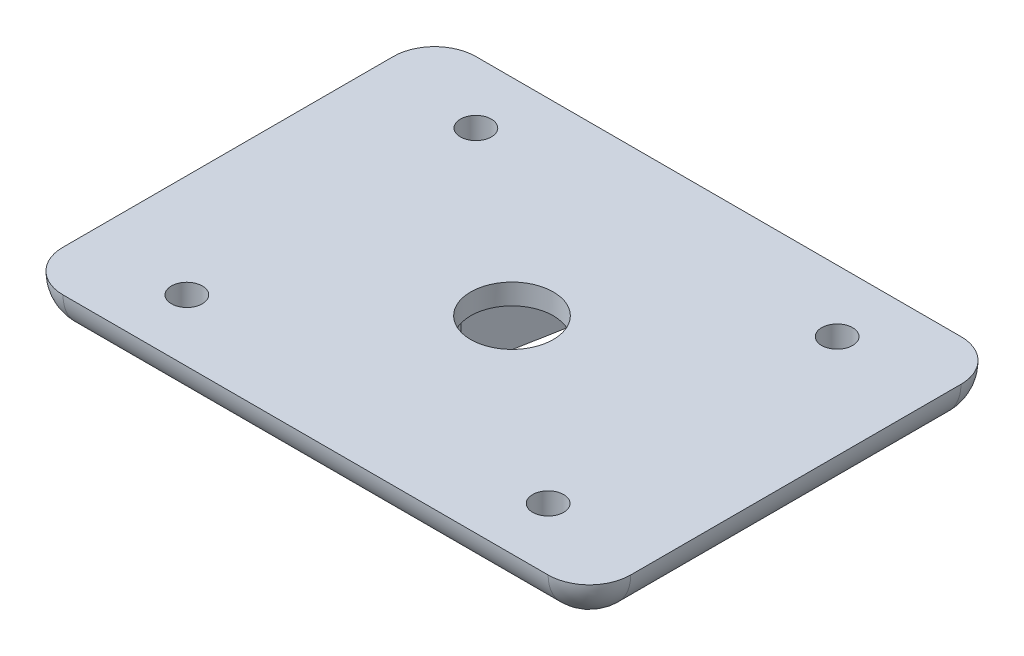
ISO-10303-21;
HEADER;
FILE_DESCRIPTION(('STEP AP214'),'2;1');
FILE_NAME('part.step','',(''),(''),'','','');
FILE_SCHEMA(('AUTOMOTIVE_DESIGN { 1 0 10303 214 1 1 1 1 }'));
ENDSEC;
DATA;
#1=APPLICATION_CONTEXT('core data for automotive mechanical design processes');
#2=APPLICATION_PROTOCOL_DEFINITION('international standard','automotive_design',2000,#1);
#3=PRODUCT_CONTEXT('',#1,'mechanical');
#4=PRODUCT('Part','Part','',(#3));
#5=PRODUCT_RELATED_PRODUCT_CATEGORY('part','',(#4));
#6=PRODUCT_DEFINITION_FORMATION('','',#4);
#7=PRODUCT_DEFINITION_CONTEXT('part definition',#1,'design');
#8=PRODUCT_DEFINITION('design','',#6,#7);
#9=PRODUCT_DEFINITION_SHAPE('','',#8);
#10=(LENGTH_UNIT() NAMED_UNIT(*) SI_UNIT(.MILLI.,.METRE.));
#11=(NAMED_UNIT(*) PLANE_ANGLE_UNIT() SI_UNIT($,.RADIAN.));
#12=(NAMED_UNIT(*) SI_UNIT($,.STERADIAN.) SOLID_ANGLE_UNIT());
#13=UNCERTAINTY_MEASURE_WITH_UNIT(LENGTH_MEASURE(1.E-05),#10,'distance_accuracy_value','');
#14=(GEOMETRIC_REPRESENTATION_CONTEXT(3) GLOBAL_UNCERTAINTY_ASSIGNED_CONTEXT((#13)) GLOBAL_UNIT_ASSIGNED_CONTEXT((#10,
#11,#12)) REPRESENTATION_CONTEXT('',''));
#15=CARTESIAN_POINT('',(0.,0.,0.));
#16=DIRECTION('',(0.,0.,1.));
#17=DIRECTION('',(1.,0.,0.));
#18=AXIS2_PLACEMENT_3D('',#15,#16,#17);
#19=CARTESIAN_POINT('',(0.,-1.,0.));
#20=DIRECTION('',(0.,1.,0.));
#21=DIRECTION('',(0.,0.,1.));
#22=AXIS2_PLACEMENT_3D('',#19,#20,#21);
#23=CYLINDRICAL_SURFACE('',#22,4.);
#24=CARTESIAN_POINT('',(0.,4.,0.));
#25=DIRECTION('',(0.,1.,0.));
#26=DIRECTION('',(0.,0.,1.));
#27=AXIS2_PLACEMENT_3D('',#24,#25,#26);
#28=CIRCLE('',#27,4.);
#29=CARTESIAN_POINT('',(0.,4.,4.));
#30=VERTEX_POINT('',#29);
#31=EDGE_CURVE('E217',#30,#30,#28,.T.);
#32=ORIENTED_EDGE('',*,*,#31,.T.);
#33=EDGE_LOOP('',(#32));
#34=FACE_BOUND('',#33,.T.);
#35=CARTESIAN_POINT('',(0.,2.,0.));
#36=DIRECTION('',(0.,-1.,0.));
#37=DIRECTION('',(0.,0.,-1.));
#38=AXIS2_PLACEMENT_3D('',#35,#36,#37);
#39=CIRCLE('',#38,4.);
#40=CARTESIAN_POINT('',(0.,2.,-4.));
#41=VERTEX_POINT('',#40);
#42=EDGE_CURVE('E45',#41,#41,#39,.F.);
#43=ORIENTED_EDGE('',*,*,#42,.F.);
#44=EDGE_LOOP('',(#43));
#45=FACE_BOUND('',#44,.T.);
#46=ADVANCED_FACE('F41',(#34,#45),#23,.F.);
#47=CARTESIAN_POINT('',(0.,-3.,0.));
#48=DIRECTION('',(0.,1.,0.));
#49=DIRECTION('',(0.,0.,1.));
#50=AXIS2_PLACEMENT_3D('',#47,#48,#49);
#51=CYLINDRICAL_SURFACE('',#50,9.70557638721724);
#52=CARTESIAN_POINT('',(0.,0.,0.));
#53=DIRECTION('',(0.,1.,0.));
#54=DIRECTION('',(0.,0.,1.));
#55=AXIS2_PLACEMENT_3D('',#52,#53,#54);
#56=CIRCLE('',#55,9.70557638721724);
#57=CARTESIAN_POINT('',(3.22672216566245,0.,-9.15349534733762));
#58=VERTEX_POINT('',#57);
#59=CARTESIAN_POINT('',(3.22672216566245,0.,9.15349534733762));
#60=VERTEX_POINT('',#59);
#61=EDGE_CURVE('E50',#58,#60,#56,.F.);
#62=ORIENTED_EDGE('',*,*,#61,.T.);
#63=DIRECTION('',(0.,-1.,0.));
#64=VECTOR('',#63,1.);
#65=CARTESIAN_POINT('',(3.22672216566245,2.,9.15349534733762));
#66=LINE('',#65,#64);
#67=CARTESIAN_POINT('',(3.22672216566245,-3.,9.15349534733762));
#68=VERTEX_POINT('',#67);
#69=EDGE_CURVE('E194',#60,#68,#66,.T.);
#70=ORIENTED_EDGE('',*,*,#69,.T.);
#71=CARTESIAN_POINT('',(0.,-3.,0.));
#72=DIRECTION('',(0.,-1.,0.));
#73=DIRECTION('',(0.,0.,-1.));
#74=AXIS2_PLACEMENT_3D('',#71,#72,#73);
#75=CIRCLE('',#74,9.70557638721724);
#76=CARTESIAN_POINT('',(3.22672216566245,-3.,-9.15349534733762));
#77=VERTEX_POINT('',#76);
#78=EDGE_CURVE('E209',#77,#68,#75,.T.);
#79=ORIENTED_EDGE('',*,*,#78,.F.);
#80=DIRECTION('',(0.,-1.,0.));
#81=VECTOR('',#80,1.);
#82=CARTESIAN_POINT('',(3.22672216566245,2.,-9.15349534733762));
#83=LINE('',#82,#81);
#84=EDGE_CURVE('E200',#58,#77,#83,.T.);
#85=ORIENTED_EDGE('',*,*,#84,.F.);
#86=EDGE_LOOP('',(#62,#70,#79,#85));
#87=FACE_BOUND('',#86,.T.);
#88=ADVANCED_FACE('F330',(#87),#51,.T.);
#89=CARTESIAN_POINT('',(0.,-3.,0.));
#90=DIRECTION('',(0.,-1.,0.));
#91=DIRECTION('',(0.,0.,-1.));
#92=AXIS2_PLACEMENT_3D('',#89,#90,#91);
#93=PLANE('',#92);
#94=DIRECTION('',(-0.18163727593894,0.,0.98336559833537));
#95=VECTOR('',#94,1.);
#96=CARTESIAN_POINT('',(3.22672216566245,-3.,9.15349534733762));
#97=LINE('',#96,#95);
#98=CARTESIAN_POINT('',(4.91746258105285,-3.,0.));
#99=VERTEX_POINT('',#98);
#100=EDGE_CURVE('E169',#99,#68,#97,.T.);
#101=ORIENTED_EDGE('',*,*,#100,.F.);
#102=DIRECTION('',(0.18163727593894,0.,0.98336559833537));
#103=VECTOR('',#102,1.);
#104=CARTESIAN_POINT('',(4.91746258105285,-3.,0.));
#105=LINE('',#104,#103);
#106=EDGE_CURVE('E171',#77,#99,#105,.T.);
#107=ORIENTED_EDGE('',*,*,#106,.F.);
#108=ORIENTED_EDGE('',*,*,#78,.T.);
#109=EDGE_LOOP('',(#101,#107,#108));
#110=FACE_BOUND('',#109,.T.);
#111=ADVANCED_FACE('F336',(#110),#93,.T.);
#112=CARTESIAN_POINT('',(0.,4.,0.));
#113=DIRECTION('',(0.,1.,0.));
#114=DIRECTION('',(0.,0.,1.));
#115=AXIS2_PLACEMENT_3D('',#112,#113,#114);
#116=PLANE('',#115);
#117=CARTESIAN_POINT('',(-17.5,4.,-14.));
#118=DIRECTION('',(0.,1.,0.));
#119=DIRECTION('',(0.,0.,1.));
#120=AXIS2_PLACEMENT_3D('',#117,#118,#119);
#121=CIRCLE('',#120,1.5);
#122=CARTESIAN_POINT('',(-17.5,4.,-12.5));
#123=VERTEX_POINT('',#122);
#124=EDGE_CURVE('E214',#123,#123,#121,.T.);
#125=ORIENTED_EDGE('',*,*,#124,.F.);
#126=EDGE_LOOP('',(#125));
#127=FACE_BOUND('',#126,.T.);
#128=CARTESIAN_POINT('',(17.5,4.,-14.));
#129=DIRECTION('',(0.,1.,0.));
#130=DIRECTION('',(0.,0.,1.));
#131=AXIS2_PLACEMENT_3D('',#128,#129,#130);
#132=CIRCLE('',#131,1.5);
#133=CARTESIAN_POINT('',(17.5,4.,-12.5));
#134=VERTEX_POINT('',#133);
#135=EDGE_CURVE('E218',#134,#134,#132,.T.);
#136=ORIENTED_EDGE('',*,*,#135,.F.);
#137=EDGE_LOOP('',(#136));
#138=FACE_BOUND('',#137,.T.);
#139=CARTESIAN_POINT('',(-17.5,4.,14.));
#140=DIRECTION('',(0.,1.,0.));
#141=DIRECTION('',(0.,0.,1.));
#142=AXIS2_PLACEMENT_3D('',#139,#140,#141);
#143=CIRCLE('',#142,1.5);
#144=CARTESIAN_POINT('',(-17.5,4.,15.5));
#145=VERTEX_POINT('',#144);
#146=EDGE_CURVE('E221',#145,#145,#143,.T.);
#147=ORIENTED_EDGE('',*,*,#146,.F.);
#148=EDGE_LOOP('',(#147));
#149=FACE_BOUND('',#148,.T.);
#150=CARTESIAN_POINT('',(17.5,4.,14.));
#151=DIRECTION('',(0.,1.,0.));
#152=DIRECTION('',(0.,0.,1.));
#153=AXIS2_PLACEMENT_3D('',#150,#151,#152);
#154=CIRCLE('',#153,1.5);
#155=CARTESIAN_POINT('',(17.5,4.,15.5));
#156=VERTEX_POINT('',#155);
#157=EDGE_CURVE('E224',#156,#156,#154,.T.);
#158=ORIENTED_EDGE('',*,*,#157,.F.);
#159=EDGE_LOOP('',(#158));
#160=FACE_BOUND('',#159,.T.);
#161=ORIENTED_EDGE('',*,*,#31,.F.);
#162=EDGE_LOOP('',(#161));
#163=FACE_BOUND('',#162,.T.);
#164=DIRECTION('',(1.,0.,0.));
#165=VECTOR('',#164,1.);
#166=CARTESIAN_POINT('',(-27.5,4.,-20.));
#167=LINE('',#166,#165);
#168=CARTESIAN_POINT('',(-23.5,4.,-20.));
#169=VERTEX_POINT('',#168);
#170=CARTESIAN_POINT('',(23.5,4.,-20.));
#171=VERTEX_POINT('',#170);
#172=EDGE_CURVE('E238',#169,#171,#167,.T.);
#173=ORIENTED_EDGE('',*,*,#172,.F.);
#174=CARTESIAN_POINT('',(-23.5,4.,-16.));
#175=DIRECTION('',(0.,1.,0.));
#176=DIRECTION('',(0.,0.,1.));
#177=AXIS2_PLACEMENT_3D('',#174,#175,#176);
#178=CIRCLE('',#177,4.);
#179=CARTESIAN_POINT('',(-27.5,4.,-16.));
#180=VERTEX_POINT('',#179);
#181=EDGE_CURVE('E276',#169,#180,#178,.T.);
#182=ORIENTED_EDGE('',*,*,#181,.T.);
#183=DIRECTION('',(0.,0.,1.));
#184=VECTOR('',#183,1.);
#185=CARTESIAN_POINT('',(-27.5,4.,-20.));
#186=LINE('',#185,#184);
#187=CARTESIAN_POINT('',(-27.5,4.,16.));
#188=VERTEX_POINT('',#187);
#189=EDGE_CURVE('E231',#180,#188,#186,.T.);
#190=ORIENTED_EDGE('',*,*,#189,.T.);
#191=CARTESIAN_POINT('',(-23.5,4.,16.));
#192=DIRECTION('',(0.,1.,0.));
#193=DIRECTION('',(0.,0.,1.));
#194=AXIS2_PLACEMENT_3D('',#191,#192,#193);
#195=CIRCLE('',#194,4.);
#196=CARTESIAN_POINT('',(-23.5,4.,20.));
#197=VERTEX_POINT('',#196);
#198=EDGE_CURVE('E262',#188,#197,#195,.T.);
#199=ORIENTED_EDGE('',*,*,#198,.T.);
#200=DIRECTION('',(1.,0.,0.));
#201=VECTOR('',#200,1.);
#202=CARTESIAN_POINT('',(-27.5,4.,20.));
#203=LINE('',#202,#201);
#204=CARTESIAN_POINT('',(23.5,4.,20.));
#205=VERTEX_POINT('',#204);
#206=EDGE_CURVE('E233',#197,#205,#203,.T.);
#207=ORIENTED_EDGE('',*,*,#206,.T.);
#208=CARTESIAN_POINT('',(23.5,4.,16.));
#209=DIRECTION('',(0.,1.,0.));
#210=DIRECTION('',(0.,0.,1.));
#211=AXIS2_PLACEMENT_3D('',#208,#209,#210);
#212=CIRCLE('',#211,4.);
#213=CARTESIAN_POINT('',(27.5,4.,16.));
#214=VERTEX_POINT('',#213);
#215=EDGE_CURVE('E253',#205,#214,#212,.T.);
#216=ORIENTED_EDGE('',*,*,#215,.T.);
#217=DIRECTION('',(0.,0.,1.));
#218=VECTOR('',#217,1.);
#219=CARTESIAN_POINT('',(27.5,4.,-20.));
#220=LINE('',#219,#218);
#221=CARTESIAN_POINT('',(27.5,4.,-16.));
#222=VERTEX_POINT('',#221);
#223=EDGE_CURVE('E236',#222,#214,#220,.T.);
#224=ORIENTED_EDGE('',*,*,#223,.F.);
#225=CARTESIAN_POINT('',(23.5,4.,-16.));
#226=DIRECTION('',(0.,1.,0.));
#227=DIRECTION('',(0.,0.,1.));
#228=AXIS2_PLACEMENT_3D('',#225,#226,#227);
#229=CIRCLE('',#228,4.);
#230=EDGE_CURVE('E272',#222,#171,#229,.T.);
#231=ORIENTED_EDGE('',*,*,#230,.T.);
#232=EDGE_LOOP('',(#173,#182,#190,#199,#207,#216,#224,#231));
#233=FACE_BOUND('',#232,.T.);
#234=ADVANCED_FACE('F297',(#127,#138,#149,#160,#163,#233),#116,.T.);
#235=CARTESIAN_POINT('',(0.,0.,0.));
#236=DIRECTION('',(0.,1.,0.));
#237=DIRECTION('',(0.,0.,1.));
#238=AXIS2_PLACEMENT_3D('',#235,#236,#237);
#239=PLANE('',#238);
#240=CARTESIAN_POINT('',(0.243749782007356,0.,-11.4789192089439));
#241=DIRECTION('',(0.,-1.,0.));
#242=DIRECTION('',(0.,0.,-1.));
#243=AXIS2_PLACEMENT_3D('',#240,#241,#242);
#244=CIRCLE('',#243,0.44);
#245=CARTESIAN_POINT('',(0.243749782007356,0.,-11.9189192089439));
#246=VERTEX_POINT('',#245);
#247=EDGE_CURVE('E174',#246,#246,#244,.T.);
#248=ORIENTED_EDGE('',*,*,#247,.F.);
#249=EDGE_LOOP('',(#248));
#250=FACE_BOUND('',#249,.T.);
#251=CARTESIAN_POINT('',(-3.22672216566246,0.,9.15349534733762));
#252=VERTEX_POINT('',#251);
#253=CARTESIAN_POINT('',(-3.22672216566246,0.,-9.15349534733762));
#254=VERTEX_POINT('',#253);
#255=EDGE_CURVE('E12',#252,#254,#56,.F.);
#256=ORIENTED_EDGE('',*,*,#255,.F.);
#257=CARTESIAN_POINT('',(0.,0.,0.));
#258=DIRECTION('',(0.,1.,0.));
#259=DIRECTION('',(0.,0.,1.));
#260=AXIS2_PLACEMENT_3D('',#257,#258,#259);
#261=CIRCLE('',#260,9.70557638721724);
#262=EDGE_CURVE('E153',#252,#60,#261,.T.);
#263=ORIENTED_EDGE('',*,*,#262,.T.);
#264=ORIENTED_EDGE('',*,*,#61,.F.);
#265=CARTESIAN_POINT('',(0.,0.,0.));
#266=DIRECTION('',(0.,1.,0.));
#267=DIRECTION('',(0.,0.,1.));
#268=AXIS2_PLACEMENT_3D('',#265,#266,#267);
#269=CIRCLE('',#268,9.70557638721724);
#270=EDGE_CURVE('E193',#58,#254,#269,.T.);
#271=ORIENTED_EDGE('',*,*,#270,.T.);
#272=EDGE_LOOP('',(#256,#263,#264,#271));
#273=FACE_BOUND('',#272,.T.);
#274=CARTESIAN_POINT('',(-17.5,0.,-14.));
#275=DIRECTION('',(0.,1.,0.));
#276=DIRECTION('',(0.,0.,1.));
#277=AXIS2_PLACEMENT_3D('',#274,#275,#276);
#278=CIRCLE('',#277,1.5);
#279=CARTESIAN_POINT('',(-17.5,0.,-12.5));
#280=VERTEX_POINT('',#279);
#281=EDGE_CURVE('E234',#280,#280,#278,.T.);
#282=ORIENTED_EDGE('',*,*,#281,.T.);
#283=EDGE_LOOP('',(#282));
#284=FACE_BOUND('',#283,.T.);
#285=CARTESIAN_POINT('',(17.5,0.,-14.));
#286=DIRECTION('',(0.,1.,0.));
#287=DIRECTION('',(0.,0.,1.));
#288=AXIS2_PLACEMENT_3D('',#285,#286,#287);
#289=CIRCLE('',#288,1.5);
#290=CARTESIAN_POINT('',(17.5,0.,-12.5));
#291=VERTEX_POINT('',#290);
#292=EDGE_CURVE('E247',#291,#291,#289,.T.);
#293=ORIENTED_EDGE('',*,*,#292,.T.);
#294=EDGE_LOOP('',(#293));
#295=FACE_BOUND('',#294,.T.);
#296=CARTESIAN_POINT('',(-17.5,0.,14.));
#297=DIRECTION('',(0.,1.,0.));
#298=DIRECTION('',(0.,0.,1.));
#299=AXIS2_PLACEMENT_3D('',#296,#297,#298);
#300=CIRCLE('',#299,1.5);
#301=CARTESIAN_POINT('',(-17.5,0.,15.5));
#302=VERTEX_POINT('',#301);
#303=EDGE_CURVE('E244',#302,#302,#300,.T.);
#304=ORIENTED_EDGE('',*,*,#303,.T.);
#305=EDGE_LOOP('',(#304));
#306=FACE_BOUND('',#305,.T.);
#307=CARTESIAN_POINT('',(17.5,0.,14.));
#308=DIRECTION('',(0.,1.,0.));
#309=DIRECTION('',(0.,0.,1.));
#310=AXIS2_PLACEMENT_3D('',#307,#308,#309);
#311=CIRCLE('',#310,1.5);
#312=CARTESIAN_POINT('',(17.5,0.,15.5));
#313=VERTEX_POINT('',#312);
#314=EDGE_CURVE('E230',#313,#313,#311,.T.);
#315=ORIENTED_EDGE('',*,*,#314,.T.);
#316=EDGE_LOOP('',(#315));
#317=FACE_BOUND('',#316,.T.);
#318=DIRECTION('',(0.,0.,1.));
#319=VECTOR('',#318,1.);
#320=CARTESIAN_POINT('',(-23.5,0.,0.));
#321=LINE('',#320,#319);
#322=CARTESIAN_POINT('',(-23.5,0.,16.));
#323=VERTEX_POINT('',#322);
#324=CARTESIAN_POINT('',(-23.5,0.,-16.));
#325=VERTEX_POINT('',#324);
#326=EDGE_CURVE('E270',#323,#325,#321,.F.);
#327=ORIENTED_EDGE('',*,*,#326,.T.);
#328=DIRECTION('',(1.,0.,0.));
#329=VECTOR('',#328,1.);
#330=CARTESIAN_POINT('',(23.5,0.,-16.));
#331=LINE('',#330,#329);
#332=CARTESIAN_POINT('',(23.5,0.,-16.));
#333=VERTEX_POINT('',#332);
#334=EDGE_CURVE('E65',#325,#333,#331,.T.);
#335=ORIENTED_EDGE('',*,*,#334,.T.);
#336=DIRECTION('',(0.,0.,1.));
#337=VECTOR('',#336,1.);
#338=CARTESIAN_POINT('',(23.5,0.,20.));
#339=LINE('',#338,#337);
#340=CARTESIAN_POINT('',(23.5,0.,16.));
#341=VERTEX_POINT('',#340);
#342=EDGE_CURVE('E241',#333,#341,#339,.T.);
#343=ORIENTED_EDGE('',*,*,#342,.T.);
#344=DIRECTION('',(1.,0.,0.));
#345=VECTOR('',#344,1.);
#346=CARTESIAN_POINT('',(0.,0.,16.));
#347=LINE('',#346,#345);
#348=EDGE_CURVE('E259',#341,#323,#347,.F.);
#349=ORIENTED_EDGE('',*,*,#348,.T.);
#350=EDGE_LOOP('',(#327,#335,#343,#349));
#351=FACE_BOUND('',#350,.T.);
#352=ADVANCED_FACE('F308',(#250,#273,#284,#295,#306,#317,#351),#239,.F.);
#353=CARTESIAN_POINT('',(17.5,-1.,14.));
#354=DIRECTION('',(0.,1.,0.));
#355=DIRECTION('',(0.,0.,1.));
#356=AXIS2_PLACEMENT_3D('',#353,#354,#355);
#357=CYLINDRICAL_SURFACE('',#356,1.5);
#358=ORIENTED_EDGE('',*,*,#157,.T.);
#359=EDGE_LOOP('',(#358));
#360=FACE_BOUND('',#359,.T.);
#361=ORIENTED_EDGE('',*,*,#314,.F.);
#362=EDGE_LOOP('',(#361));
#363=FACE_BOUND('',#362,.T.);
#364=ADVANCED_FACE('F343',(#360,#363),#357,.F.);
#365=CARTESIAN_POINT('',(-17.5,-1.,14.));
#366=DIRECTION('',(0.,1.,0.));
#367=DIRECTION('',(0.,0.,1.));
#368=AXIS2_PLACEMENT_3D('',#365,#366,#367);
#369=CYLINDRICAL_SURFACE('',#368,1.5);
#370=ORIENTED_EDGE('',*,*,#146,.T.);
#371=EDGE_LOOP('',(#370));
#372=FACE_BOUND('',#371,.T.);
#373=ORIENTED_EDGE('',*,*,#303,.F.);
#374=EDGE_LOOP('',(#373));
#375=FACE_BOUND('',#374,.T.);
#376=ADVANCED_FACE('F536',(#372,#375),#369,.F.);
#377=CARTESIAN_POINT('',(17.5,-1.,-14.));
#378=DIRECTION('',(0.,1.,0.));
#379=DIRECTION('',(0.,0.,1.));
#380=AXIS2_PLACEMENT_3D('',#377,#378,#379);
#381=CYLINDRICAL_SURFACE('',#380,1.5);
#382=ORIENTED_EDGE('',*,*,#135,.T.);
#383=EDGE_LOOP('',(#382));
#384=FACE_BOUND('',#383,.T.);
#385=ORIENTED_EDGE('',*,*,#292,.F.);
#386=EDGE_LOOP('',(#385));
#387=FACE_BOUND('',#386,.T.);
#388=ADVANCED_FACE('F533',(#384,#387),#381,.F.);
#389=CARTESIAN_POINT('',(-17.5,-1.,-14.));
#390=DIRECTION('',(0.,1.,0.));
#391=DIRECTION('',(0.,0.,1.));
#392=AXIS2_PLACEMENT_3D('',#389,#390,#391);
#393=CYLINDRICAL_SURFACE('',#392,1.5);
#394=ORIENTED_EDGE('',*,*,#124,.T.);
#395=EDGE_LOOP('',(#394));
#396=FACE_BOUND('',#395,.T.);
#397=ORIENTED_EDGE('',*,*,#281,.F.);
#398=EDGE_LOOP('',(#397));
#399=FACE_BOUND('',#398,.T.);
#400=ADVANCED_FACE('F353',(#396,#399),#393,.F.);
#401=CARTESIAN_POINT('',(23.5,4.,0.));
#402=DIRECTION('',(0.,0.,-1.));
#403=DIRECTION('',(-1.,0.,0.));
#404=AXIS2_PLACEMENT_3D('',#401,#402,#403);
#405=CYLINDRICAL_SURFACE('',#404,4.);
#406=ORIENTED_EDGE('',*,*,#342,.F.);
#407=CARTESIAN_POINT('',(23.5,4.,-16.));
#408=DIRECTION('',(0.,0.,-1.));
#409=DIRECTION('',(-1.,0.,0.));
#410=AXIS2_PLACEMENT_3D('',#407,#408,#409);
#411=CIRCLE('',#410,4.);
#412=EDGE_CURVE('E281',#333,#222,#411,.F.);
#413=ORIENTED_EDGE('',*,*,#412,.T.);
#414=ORIENTED_EDGE('',*,*,#223,.T.);
#415=CARTESIAN_POINT('',(23.5,4.,16.));
#416=DIRECTION('',(0.,0.,-1.));
#417=DIRECTION('',(-1.,0.,0.));
#418=AXIS2_PLACEMENT_3D('',#415,#416,#417);
#419=CIRCLE('',#418,4.);
#420=EDGE_CURVE('E256',#214,#341,#419,.T.);
#421=ORIENTED_EDGE('',*,*,#420,.T.);
#422=EDGE_LOOP('',(#406,#413,#414,#421));
#423=FACE_BOUND('',#422,.T.);
#424=ADVANCED_FACE('F295',(#423),#405,.T.);
#425=CARTESIAN_POINT('',(-27.5,4.,16.));
#426=DIRECTION('',(1.,0.,0.));
#427=DIRECTION('',(0.,0.,-1.));
#428=AXIS2_PLACEMENT_3D('',#425,#426,#427);
#429=CYLINDRICAL_SURFACE('',#428,4.);
#430=ORIENTED_EDGE('',*,*,#206,.F.);
#431=CARTESIAN_POINT('',(-23.5,4.,16.));
#432=DIRECTION('',(1.,0.,0.));
#433=DIRECTION('',(0.,0.,-1.));
#434=AXIS2_PLACEMENT_3D('',#431,#432,#433);
#435=CIRCLE('',#434,4.);
#436=EDGE_CURVE('E267',#197,#323,#435,.T.);
#437=ORIENTED_EDGE('',*,*,#436,.T.);
#438=ORIENTED_EDGE('',*,*,#348,.F.);
#439=CARTESIAN_POINT('',(23.5,4.,16.));
#440=DIRECTION('',(1.,0.,0.));
#441=DIRECTION('',(0.,0.,-1.));
#442=AXIS2_PLACEMENT_3D('',#439,#440,#441);
#443=CIRCLE('',#442,4.);
#444=EDGE_CURVE('E227',#205,#341,#443,.T.);
#445=ORIENTED_EDGE('',*,*,#444,.F.);
#446=EDGE_LOOP('',(#430,#437,#438,#445));
#447=FACE_BOUND('',#446,.T.);
#448=ADVANCED_FACE('F306',(#447),#429,.T.);
#449=CARTESIAN_POINT('',(23.5,4.,16.));
#450=DIRECTION('',(0.,0.,-1.));
#451=DIRECTION('',(-1.,0.,0.));
#452=AXIS2_PLACEMENT_3D('',#449,#450,#451);
#453=SPHERICAL_SURFACE('',#452,4.);
#454=ORIENTED_EDGE('',*,*,#444,.T.);
#455=ORIENTED_EDGE('',*,*,#420,.F.);
#456=ORIENTED_EDGE('',*,*,#215,.F.);
#457=EDGE_LOOP('',(#454,#455,#456));
#458=FACE_BOUND('',#457,.T.);
#459=ADVANCED_FACE('F303',(#458),#453,.T.);
#460=CARTESIAN_POINT('',(-23.5,4.,-20.));
#461=DIRECTION('',(0.,0.,1.));
#462=DIRECTION('',(1.,0.,0.));
#463=AXIS2_PLACEMENT_3D('',#460,#461,#462);
#464=CYLINDRICAL_SURFACE('',#463,4.);
#465=ORIENTED_EDGE('',*,*,#189,.F.);
#466=CARTESIAN_POINT('',(-23.5,4.,-16.));
#467=DIRECTION('',(0.,0.,1.));
#468=DIRECTION('',(1.,0.,0.));
#469=AXIS2_PLACEMENT_3D('',#466,#467,#468);
#470=CIRCLE('',#469,4.);
#471=EDGE_CURVE('E278',#180,#325,#470,.T.);
#472=ORIENTED_EDGE('',*,*,#471,.T.);
#473=ORIENTED_EDGE('',*,*,#326,.F.);
#474=CARTESIAN_POINT('',(-23.5,4.,16.));
#475=DIRECTION('',(0.,0.,1.));
#476=DIRECTION('',(1.,0.,0.));
#477=AXIS2_PLACEMENT_3D('',#474,#475,#476);
#478=CIRCLE('',#477,4.);
#479=EDGE_CURVE('E265',#188,#323,#478,.T.);
#480=ORIENTED_EDGE('',*,*,#479,.F.);
#481=EDGE_LOOP('',(#465,#472,#473,#480));
#482=FACE_BOUND('',#481,.T.);
#483=ADVANCED_FACE('F313',(#482),#464,.T.);
#484=CARTESIAN_POINT('',(-23.5,4.,16.));
#485=DIRECTION('',(1.,0.,0.));
#486=DIRECTION('',(0.,0.,-1.));
#487=AXIS2_PLACEMENT_3D('',#484,#485,#486);
#488=SPHERICAL_SURFACE('',#487,4.);
#489=ORIENTED_EDGE('',*,*,#479,.T.);
#490=ORIENTED_EDGE('',*,*,#436,.F.);
#491=ORIENTED_EDGE('',*,*,#198,.F.);
#492=EDGE_LOOP('',(#489,#490,#491));
#493=FACE_BOUND('',#492,.T.);
#494=ADVANCED_FACE('F320',(#493),#488,.T.);
#495=CARTESIAN_POINT('',(23.5,4.,-16.));
#496=DIRECTION('',(0.,0.,-1.));
#497=DIRECTION('',(-1.,0.,0.));
#498=AXIS2_PLACEMENT_3D('',#495,#496,#497);
#499=SPHERICAL_SURFACE('',#498,4.);
#500=ORIENTED_EDGE('',*,*,#230,.F.);
#501=ORIENTED_EDGE('',*,*,#412,.F.);
#502=CARTESIAN_POINT('',(23.5,4.,-16.));
#503=DIRECTION('',(-1.,0.,0.));
#504=DIRECTION('',(0.,0.,1.));
#505=AXIS2_PLACEMENT_3D('',#502,#503,#504);
#506=CIRCLE('',#505,4.);
#507=EDGE_CURVE('E274',#171,#333,#506,.T.);
#508=ORIENTED_EDGE('',*,*,#507,.F.);
#509=EDGE_LOOP('',(#500,#501,#508));
#510=FACE_BOUND('',#509,.T.);
#511=ADVANCED_FACE('F43',(#510),#499,.T.);
#512=CARTESIAN_POINT('',(0.,4.,-16.));
#513=DIRECTION('',(-1.,0.,0.));
#514=DIRECTION('',(0.,0.,1.));
#515=AXIS2_PLACEMENT_3D('',#512,#513,#514);
#516=CYLINDRICAL_SURFACE('',#515,4.);
#517=ORIENTED_EDGE('',*,*,#507,.T.);
#518=ORIENTED_EDGE('',*,*,#334,.F.);
#519=CARTESIAN_POINT('',(-23.5,4.,-16.));
#520=DIRECTION('',(-1.,0.,0.));
#521=DIRECTION('',(0.,0.,1.));
#522=AXIS2_PLACEMENT_3D('',#519,#520,#521);
#523=CIRCLE('',#522,4.);
#524=EDGE_CURVE('E212',#169,#325,#523,.T.);
#525=ORIENTED_EDGE('',*,*,#524,.F.);
#526=ORIENTED_EDGE('',*,*,#172,.T.);
#527=EDGE_LOOP('',(#517,#518,#525,#526));
#528=FACE_BOUND('',#527,.T.);
#529=ADVANCED_FACE('F288',(#528),#516,.T.);
#530=CARTESIAN_POINT('',(-23.5,4.,-16.));
#531=DIRECTION('',(0.,0.,-1.));
#532=DIRECTION('',(-1.,0.,0.));
#533=AXIS2_PLACEMENT_3D('',#530,#531,#532);
#534=SPHERICAL_SURFACE('',#533,4.);
#535=ORIENTED_EDGE('',*,*,#524,.T.);
#536=ORIENTED_EDGE('',*,*,#471,.F.);
#537=ORIENTED_EDGE('',*,*,#181,.F.);
#538=EDGE_LOOP('',(#535,#536,#537));
#539=FACE_BOUND('',#538,.T.);
#540=ADVANCED_FACE('F318',(#539),#534,.T.);
#541=ORIENTED_EDGE('',*,*,#255,.T.);
#542=DIRECTION('',(0.,-1.,0.));
#543=VECTOR('',#542,1.);
#544=CARTESIAN_POINT('',(-3.22672216566246,2.,-9.15349534733762));
#545=LINE('',#544,#543);
#546=CARTESIAN_POINT('',(-3.22672216566246,-3.,-9.15349534733762));
#547=VERTEX_POINT('',#546);
#548=EDGE_CURVE('E204',#254,#547,#545,.T.);
#549=ORIENTED_EDGE('',*,*,#548,.T.);
#550=CARTESIAN_POINT('',(-3.22672216566246,-3.,9.15349534733762));
#551=VERTEX_POINT('',#550);
#552=EDGE_CURVE('E213',#551,#547,#75,.T.);
#553=ORIENTED_EDGE('',*,*,#552,.F.);
#554=DIRECTION('',(0.,-1.,0.));
#555=VECTOR('',#554,1.);
#556=CARTESIAN_POINT('',(-3.22672216566246,2.,9.15349534733762));
#557=LINE('',#556,#555);
#558=EDGE_CURVE('E57',#252,#551,#557,.T.);
#559=ORIENTED_EDGE('',*,*,#558,.F.);
#560=EDGE_LOOP('',(#541,#549,#553,#559));
#561=FACE_BOUND('',#560,.T.);
#562=ADVANCED_FACE('F339',(#561),#51,.T.);
#563=DIRECTION('',(0.18163727593894,0.,-0.983365598335371));
#564=VECTOR('',#563,1.);
#565=CARTESIAN_POINT('',(-4.91746258105285,-3.,0.));
#566=LINE('',#565,#564);
#567=CARTESIAN_POINT('',(-4.91746258105285,-3.,0.));
#568=VERTEX_POINT('',#567);
#569=EDGE_CURVE('E186',#568,#547,#566,.T.);
#570=ORIENTED_EDGE('',*,*,#569,.F.);
#571=DIRECTION('',(-0.18163727593894,0.,-0.983365598335371));
#572=VECTOR('',#571,1.);
#573=CARTESIAN_POINT('',(-3.22672216566246,-3.,9.15349534733762));
#574=LINE('',#573,#572);
#575=EDGE_CURVE('E184',#551,#568,#574,.T.);
#576=ORIENTED_EDGE('',*,*,#575,.F.);
#577=ORIENTED_EDGE('',*,*,#552,.T.);
#578=EDGE_LOOP('',(#570,#576,#577));
#579=FACE_BOUND('',#578,.T.);
#580=ADVANCED_FACE('F421',(#579),#93,.T.);
#581=CARTESIAN_POINT('',(0.,2.,0.));
#582=DIRECTION('',(0.,-1.,0.));
#583=DIRECTION('',(0.,0.,-1.));
#584=AXIS2_PLACEMENT_3D('',#581,#582,#583);
#585=PLANE('',#584);
#586=CARTESIAN_POINT('',(0.,2.,0.));
#587=DIRECTION('',(0.,-1.,0.));
#588=DIRECTION('',(0.,0.,-1.));
#589=AXIS2_PLACEMENT_3D('',#586,#587,#588);
#590=CIRCLE('',#589,9.70557638721724);
#591=CARTESIAN_POINT('',(3.22672216566245,2.,9.15349534733762));
#592=VERTEX_POINT('',#591);
#593=CARTESIAN_POINT('',(-3.22672216566246,2.,9.15349534733762));
#594=VERTEX_POINT('',#593);
#595=EDGE_CURVE('E150',#592,#594,#590,.T.);
#596=ORIENTED_EDGE('',*,*,#595,.T.);
#597=DIRECTION('',(-0.18163727593894,0.,-0.983365598335371));
#598=VECTOR('',#597,1.);
#599=CARTESIAN_POINT('',(-3.22672216566246,2.,9.15349534733762));
#600=LINE('',#599,#598);
#601=CARTESIAN_POINT('',(-4.91746258105285,2.,0.));
#602=VERTEX_POINT('',#601);
#603=EDGE_CURVE('E157',#594,#602,#600,.T.);
#604=ORIENTED_EDGE('',*,*,#603,.T.);
#605=DIRECTION('',(0.18163727593894,0.,-0.983365598335371));
#606=VECTOR('',#605,1.);
#607=CARTESIAN_POINT('',(-4.91746258105285,2.,0.));
#608=LINE('',#607,#606);
#609=CARTESIAN_POINT('',(-3.22672216566246,2.,-9.15349534733762));
#610=VERTEX_POINT('',#609);
#611=EDGE_CURVE('E162',#602,#610,#608,.T.);
#612=ORIENTED_EDGE('',*,*,#611,.T.);
#613=CARTESIAN_POINT('',(0.,2.,0.));
#614=DIRECTION('',(0.,-1.,0.));
#615=DIRECTION('',(0.,0.,-1.));
#616=AXIS2_PLACEMENT_3D('',#613,#614,#615);
#617=CIRCLE('',#616,9.70557638721724);
#618=CARTESIAN_POINT('',(3.22672216566245,2.,-9.15349534733762));
#619=VERTEX_POINT('',#618);
#620=EDGE_CURVE('E178',#610,#619,#617,.T.);
#621=ORIENTED_EDGE('',*,*,#620,.T.);
#622=DIRECTION('',(0.18163727593894,0.,0.98336559833537));
#623=VECTOR('',#622,1.);
#624=CARTESIAN_POINT('',(4.91746258105285,2.,0.));
#625=LINE('',#624,#623);
#626=CARTESIAN_POINT('',(4.91746258105285,2.,0.));
#627=VERTEX_POINT('',#626);
#628=EDGE_CURVE('E181',#619,#627,#625,.T.);
#629=ORIENTED_EDGE('',*,*,#628,.T.);
#630=DIRECTION('',(-0.18163727593894,0.,0.98336559833537));
#631=VECTOR('',#630,1.);
#632=CARTESIAN_POINT('',(3.22672216566245,2.,9.15349534733762));
#633=LINE('',#632,#631);
#634=EDGE_CURVE('E168',#627,#592,#633,.T.);
#635=ORIENTED_EDGE('',*,*,#634,.T.);
#636=EDGE_LOOP('',(#596,#604,#612,#621,#629,#635));
#637=FACE_BOUND('',#636,.T.);
#638=ORIENTED_EDGE('',*,*,#42,.T.);
#639=EDGE_LOOP('',(#638));
#640=FACE_BOUND('',#639,.T.);
#641=ADVANCED_FACE('F164',(#637,#640),#585,.T.);
#642=CARTESIAN_POINT('',(0.,2.,0.));
#643=DIRECTION('',(0.,-1.,0.));
#644=DIRECTION('',(0.,0.,-1.));
#645=AXIS2_PLACEMENT_3D('',#642,#643,#644);
#646=CYLINDRICAL_SURFACE('',#645,9.70557638721724);
#647=EDGE_CURVE('E145',#594,#252,#557,.T.);
#648=ORIENTED_EDGE('',*,*,#647,.F.);
#649=ORIENTED_EDGE('',*,*,#595,.F.);
#650=EDGE_CURVE('E191',#592,#60,#66,.T.);
#651=ORIENTED_EDGE('',*,*,#650,.T.);
#652=ORIENTED_EDGE('',*,*,#262,.F.);
#653=EDGE_LOOP('',(#648,#649,#651,#652));
#654=FACE_BOUND('',#653,.T.);
#655=ADVANCED_FACE('F147',(#654),#646,.F.);
#656=CARTESIAN_POINT('',(0.,2.,0.));
#657=DIRECTION('',(0.,-1.,0.));
#658=DIRECTION('',(0.,0.,-1.));
#659=AXIS2_PLACEMENT_3D('',#656,#657,#658);
#660=CYLINDRICAL_SURFACE('',#659,9.70557638721724);
#661=EDGE_CURVE('E197',#619,#58,#83,.T.);
#662=ORIENTED_EDGE('',*,*,#661,.F.);
#663=ORIENTED_EDGE('',*,*,#620,.F.);
#664=EDGE_CURVE('E201',#610,#254,#545,.T.);
#665=ORIENTED_EDGE('',*,*,#664,.T.);
#666=ORIENTED_EDGE('',*,*,#270,.F.);
#667=EDGE_LOOP('',(#662,#663,#665,#666));
#668=FACE_BOUND('',#667,.T.);
#669=ADVANCED_FACE('F450',(#668),#660,.F.);
#670=CARTESIAN_POINT('',(3.22672216566245,2.,9.15349534733762));
#671=DIRECTION('',(0.983365598335371,0.,0.18163727593894));
#672=DIRECTION('',(0.18163727593894,0.,-0.983365598335371));
#673=AXIS2_PLACEMENT_3D('',#670,#671,#672);
#674=PLANE('',#673);
#675=ORIENTED_EDGE('',*,*,#100,.T.);
#676=ORIENTED_EDGE('',*,*,#69,.F.);
#677=ORIENTED_EDGE('',*,*,#650,.F.);
#678=ORIENTED_EDGE('',*,*,#634,.F.);
#679=DIRECTION('',(0.,-1.,0.));
#680=VECTOR('',#679,1.);
#681=CARTESIAN_POINT('',(4.91746258105285,2.,0.));
#682=LINE('',#681,#680);
#683=EDGE_CURVE('E195',#627,#99,#682,.T.);
#684=ORIENTED_EDGE('',*,*,#683,.T.);
#685=EDGE_LOOP('',(#675,#676,#677,#678,#684));
#686=FACE_BOUND('',#685,.T.);
#687=ADVANCED_FACE('F459',(#686),#674,.F.);
#688=CARTESIAN_POINT('',(4.91746258105285,2.,0.));
#689=DIRECTION('',(0.983365598335371,0.,-0.18163727593894));
#690=DIRECTION('',(-0.18163727593894,0.,-0.983365598335371));
#691=AXIS2_PLACEMENT_3D('',#688,#689,#690);
#692=PLANE('',#691);
#693=ORIENTED_EDGE('',*,*,#106,.T.);
#694=ORIENTED_EDGE('',*,*,#683,.F.);
#695=ORIENTED_EDGE('',*,*,#628,.F.);
#696=ORIENTED_EDGE('',*,*,#661,.T.);
#697=ORIENTED_EDGE('',*,*,#84,.T.);
#698=EDGE_LOOP('',(#693,#694,#695,#696,#697));
#699=FACE_BOUND('',#698,.T.);
#700=ADVANCED_FACE('F469',(#699),#692,.F.);
#701=CARTESIAN_POINT('',(-4.91746258105285,2.,0.));
#702=DIRECTION('',(-0.983365598335371,0.,-0.18163727593894));
#703=DIRECTION('',(-0.18163727593894,0.,0.983365598335371));
#704=AXIS2_PLACEMENT_3D('',#701,#702,#703);
#705=PLANE('',#704);
#706=ORIENTED_EDGE('',*,*,#569,.T.);
#707=ORIENTED_EDGE('',*,*,#548,.F.);
#708=ORIENTED_EDGE('',*,*,#664,.F.);
#709=ORIENTED_EDGE('',*,*,#611,.F.);
#710=DIRECTION('',(0.,-1.,0.));
#711=VECTOR('',#710,1.);
#712=CARTESIAN_POINT('',(-4.91746258105285,2.,0.));
#713=LINE('',#712,#711);
#714=EDGE_CURVE('E154',#602,#568,#713,.T.);
#715=ORIENTED_EDGE('',*,*,#714,.T.);
#716=EDGE_LOOP('',(#706,#707,#708,#709,#715));
#717=FACE_BOUND('',#716,.T.);
#718=ADVANCED_FACE('F479',(#717),#705,.F.);
#719=CARTESIAN_POINT('',(-3.22672216566246,2.,9.15349534733762));
#720=DIRECTION('',(-0.983365598335371,0.,0.18163727593894));
#721=DIRECTION('',(0.18163727593894,0.,0.983365598335371));
#722=AXIS2_PLACEMENT_3D('',#719,#720,#721);
#723=PLANE('',#722);
#724=ORIENTED_EDGE('',*,*,#575,.T.);
#725=ORIENTED_EDGE('',*,*,#714,.F.);
#726=ORIENTED_EDGE('',*,*,#603,.F.);
#727=ORIENTED_EDGE('',*,*,#647,.T.);
#728=ORIENTED_EDGE('',*,*,#558,.T.);
#729=EDGE_LOOP('',(#724,#725,#726,#727,#728));
#730=FACE_BOUND('',#729,.T.);
#731=ADVANCED_FACE('F158',(#730),#723,.F.);
#732=CARTESIAN_POINT('',(0.243749782007356,2.,-11.4789192089439));
#733=DIRECTION('',(0.,-1.,0.));
#734=DIRECTION('',(0.,0.,-1.));
#735=AXIS2_PLACEMENT_3D('',#732,#733,#734);
#736=CYLINDRICAL_SURFACE('',#735,0.44);
#737=CARTESIAN_POINT('',(0.243749782007356,2.,-11.4789192089439));
#738=DIRECTION('',(0.,-1.,0.));
#739=DIRECTION('',(0.,0.,-1.));
#740=AXIS2_PLACEMENT_3D('',#737,#738,#739);
#741=CIRCLE('',#740,0.44);
#742=CARTESIAN_POINT('',(0.243749782007356,2.,-11.9189192089439));
#743=VERTEX_POINT('',#742);
#744=EDGE_CURVE('E187',#743,#743,#741,.T.);
#745=ORIENTED_EDGE('',*,*,#744,.F.);
#746=EDGE_LOOP('',(#745));
#747=FACE_BOUND('',#746,.T.);
#748=ORIENTED_EDGE('',*,*,#247,.T.);
#749=EDGE_LOOP('',(#748));
#750=FACE_BOUND('',#749,.T.);
#751=ADVANCED_FACE('F498',(#747,#750),#736,.F.);
#752=CARTESIAN_POINT('',(0.243749782007356,2.,-11.4789192089439));
#753=DIRECTION('',(0.,-1.,0.));
#754=DIRECTION('',(0.,0.,-1.));
#755=AXIS2_PLACEMENT_3D('',#752,#753,#754);
#756=PLANE('',#755);
#757=ORIENTED_EDGE('',*,*,#744,.T.);
#758=EDGE_LOOP('',(#757));
#759=FACE_BOUND('',#758,.T.);
#760=ADVANCED_FACE('F516',(#759),#756,.T.);
#761=CLOSED_SHELL('',(#46,#88,#111,#234,#352,#364,#376,#388,#400,#424,#448,#459,#483,#494,#511,
#529,#540,#562,#580,#641,#655,#669,#687,#700,#718,#731,#751,#760));
#762=MANIFOLD_SOLID_BREP('B2',#761);
#763=ADVANCED_BREP_SHAPE_REPRESENTATION('',(#18,#762),#14);
#764=SHAPE_DEFINITION_REPRESENTATION(#9,#763);
ENDSEC;
END-ISO-10303-21;
